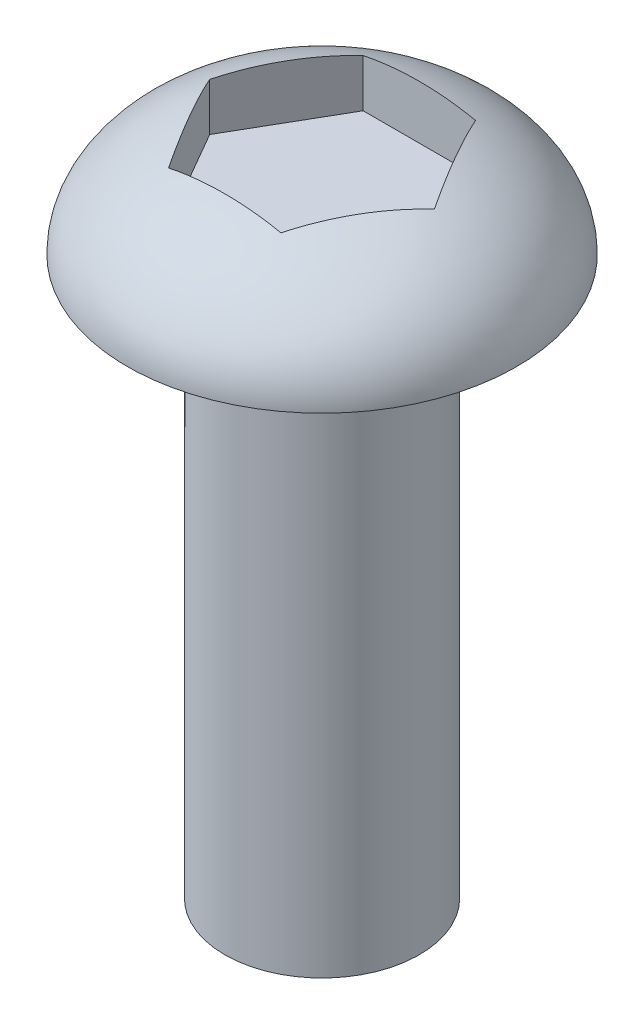
ISO-10303-21;
HEADER;
FILE_DESCRIPTION(('STEP AP214'),'2;1');
FILE_NAME('part.step','',(''),(''),'','','');
FILE_SCHEMA(('AUTOMOTIVE_DESIGN { 1 0 10303 214 1 1 1 1 }'));
ENDSEC;
DATA;
#1=APPLICATION_CONTEXT('core data for automotive mechanical design processes');
#2=APPLICATION_PROTOCOL_DEFINITION('international standard','automotive_design',2000,#1);
#3=PRODUCT_CONTEXT('',#1,'mechanical');
#4=PRODUCT('Part','Part','',(#3));
#5=PRODUCT_RELATED_PRODUCT_CATEGORY('part','',(#4));
#6=PRODUCT_DEFINITION_FORMATION('','',#4);
#7=PRODUCT_DEFINITION_CONTEXT('part definition',#1,'design');
#8=PRODUCT_DEFINITION('design','',#6,#7);
#9=PRODUCT_DEFINITION_SHAPE('','',#8);
#10=(LENGTH_UNIT() NAMED_UNIT(*) SI_UNIT(.MILLI.,.METRE.));
#11=(NAMED_UNIT(*) PLANE_ANGLE_UNIT() SI_UNIT($,.RADIAN.));
#12=(NAMED_UNIT(*) SI_UNIT($,.STERADIAN.) SOLID_ANGLE_UNIT());
#13=UNCERTAINTY_MEASURE_WITH_UNIT(LENGTH_MEASURE(1.E-05),#10,'distance_accuracy_value','');
#14=(GEOMETRIC_REPRESENTATION_CONTEXT(3) GLOBAL_UNCERTAINTY_ASSIGNED_CONTEXT((#13)) GLOBAL_UNIT_ASSIGNED_CONTEXT((#10,
#11,#12)) REPRESENTATION_CONTEXT('',''));
#15=CARTESIAN_POINT('',(0.,0.,0.));
#16=DIRECTION('',(0.,0.,1.));
#17=DIRECTION('',(1.,0.,0.));
#18=AXIS2_PLACEMENT_3D('',#15,#16,#17);
#19=CARTESIAN_POINT('',(0.,14.334,0.));
#20=DIRECTION('',(0.,-1.,0.));
#21=DIRECTION('',(0.,0.,-1.));
#22=AXIS2_PLACEMENT_3D('',#19,#20,#21);
#23=CYLINDRICAL_SURFACE('',#22,2.5);
#24=CARTESIAN_POINT('',(0.,14.334,0.));
#25=DIRECTION('',(0.,1.,0.));
#26=DIRECTION('',(0.,0.,1.));
#27=AXIS2_PLACEMENT_3D('',#24,#25,#26);
#28=CIRCLE('',#27,2.5);
#29=CARTESIAN_POINT('',(0.,14.334,2.5));
#30=VERTEX_POINT('',#29);
#31=EDGE_CURVE('E247',#30,#30,#28,.T.);
#32=ORIENTED_EDGE('',*,*,#31,.F.);
#33=EDGE_LOOP('',(#32));
#34=FACE_BOUND('',#33,.T.);
#35=CARTESIAN_POINT('',(0.,0.,0.));
#36=DIRECTION('',(0.,1.,0.));
#37=DIRECTION('',(0.,0.,1.));
#38=AXIS2_PLACEMENT_3D('',#35,#36,#37);
#39=CIRCLE('',#38,2.5);
#40=CARTESIAN_POINT('',(0.,0.,2.5));
#41=VERTEX_POINT('',#40);
#42=EDGE_CURVE('E250',#41,#41,#39,.T.);
#43=ORIENTED_EDGE('',*,*,#42,.T.);
#44=EDGE_LOOP('',(#43));
#45=FACE_BOUND('',#44,.T.);
#46=ADVANCED_FACE('F55',(#34,#45),#23,.T.);
#47=CARTESIAN_POINT('',(0.,0.,0.));
#48=DIRECTION('',(0.,1.,0.));
#49=DIRECTION('',(0.,0.,1.));
#50=AXIS2_PLACEMENT_3D('',#47,#48,#49);
#51=PLANE('',#50);
#52=ORIENTED_EDGE('',*,*,#42,.F.);
#53=EDGE_LOOP('',(#52));
#54=FACE_BOUND('',#53,.T.);
#55=ADVANCED_FACE('F238',(#54),#51,.F.);
#56=CARTESIAN_POINT('',(0.,14.334,0.));
#57=DIRECTION('',(0.,-1.,0.));
#58=DIRECTION('',(0.,0.,-1.));
#59=AXIS2_PLACEMENT_3D('',#56,#57,#58);
#60=PLANE('',#59);
#61=ORIENTED_EDGE('',*,*,#31,.T.);
#62=EDGE_LOOP('',(#61));
#63=FACE_BOUND('',#62,.T.);
#64=CARTESIAN_POINT('',(0.,14.334,0.));
#65=DIRECTION('',(0.,-1.,0.));
#66=DIRECTION('',(0.,0.,-1.));
#67=AXIS2_PLACEMENT_3D('',#64,#65,#66);
#68=CIRCLE('',#67,5.);
#69=CARTESIAN_POINT('',(0.,14.334,-5.));
#70=VERTEX_POINT('',#69);
#71=EDGE_CURVE('E152',#70,#70,#68,.T.);
#72=ORIENTED_EDGE('',*,*,#71,.T.);
#73=EDGE_LOOP('',(#72));
#74=FACE_BOUND('',#73,.T.);
#75=ADVANCED_FACE('F173',(#63,#74),#60,.T.);
#76=CARTESIAN_POINT('',(0.,14.334,0.));
#77=DIRECTION('',(1.,0.,0.));
#78=DIRECTION('',(0.,0.,-1.));
#79=AXIS2_PLACEMENT_3D('',#76,#77,#78);
#80=ELLIPSE('',#79,5.,3.);
#81=TRIMMED_CURVE('',#80,(PARAMETER_VALUE(-1.5707963267949)),(PARAMETER_VALUE(1.5707963267949)),
.T.,.PARAMETER.);
#82=CARTESIAN_POINT('',(0.,14.334,0.));
#83=DIRECTION('',(0.,-1.,0.));
#84=AXIS1_PLACEMENT('',#82,#83);
#85=SURFACE_OF_REVOLUTION('',#81,#84);
#86=CARTESIAN_POINT('',(1.44337567297407,16.7834897427832,2.5));
#87=CARTESIAN_POINT('',(1.49120527666938,16.803775342124,2.41715669629383));
#88=CARTESIAN_POINT('',(1.53925461730029,16.8218989634493,2.33393279705091));
#89=CARTESIAN_POINT('',(1.63569822698069,16.8539373538292,2.16688756501911));
#90=CARTESIAN_POINT('',(1.68409245968437,16.8678525598582,2.08306629518303));
#91=CARTESIAN_POINT('',(1.82970216155214,16.9034727249266,1.8308628934731));
#92=CARTESIAN_POINT('',(1.92730855645312,16.9190371611483,1.66180365836097));
#93=CARTESIAN_POINT('',(2.1211665221515,16.9341120007637,1.32603181231942));
#94=CARTESIAN_POINT('',(2.21741331466225,16.9338876455773,1.15932747762528));
#95=CARTESIAN_POINT('',(2.40954917302526,16.9180413413124,0.826538408984685));
#96=CARTESIAN_POINT('',(2.50543842664516,16.9024291319321,0.660453349815152));
#97=CARTESIAN_POINT('',(2.64868825337643,16.8671068327157,0.412337371741155));
#98=CARTESIAN_POINT('',(2.69642789242686,16.8533124296512,0.329649891370808));
#99=CARTESIAN_POINT('',(2.79176839563484,16.8215609300231,0.1645152957954));
#100=CARTESIAN_POINT('',(2.83936780183945,16.8035863476653,0.0820707058389169));
#101=CARTESIAN_POINT('',(2.88675134594812,16.7834897427832,0.));
#102=B_SPLINE_CURVE_WITH_KNOTS('',3,(#86,#87,#88,#89,#90,#91,#92,#93,#94,#95,#96,#97,#98,#99,
#100,#101),.UNSPECIFIED.,.F.,.F.,(4,2,2,2,2,2,2,4),(0.,0.293301097681086,0.586571730425494,
1.17333340904144,1.75024026543772,2.32678220463683,2.61611671310365,2.90668400509651),.UNSPECIFIED.);
#103=CARTESIAN_POINT('',(1.44337567297407,16.7834897427832,2.5));
#104=VERTEX_POINT('',#103);
#105=CARTESIAN_POINT('',(2.88675134594813,16.7834897427832,0.));
#106=VERTEX_POINT('',#105);
#107=EDGE_CURVE('E11',#104,#106,#102,.T.);
#108=ORIENTED_EDGE('',*,*,#107,.F.);
#109=CARTESIAN_POINT('',(-1.44337567297406,16.7834897427832,2.5));
#110=CARTESIAN_POINT('',(-1.34771646558344,16.803775342124,2.5));
#111=CARTESIAN_POINT('',(-1.25161778432161,16.8218989634493,2.5));
#112=CARTESIAN_POINT('',(-1.0587305649608,16.8539373538292,2.5));
#113=CARTESIAN_POINT('',(-0.961942099553453,16.8678525598582,2.5));
#114=CARTESIAN_POINT('',(-0.670722695817917,16.9034727249266,2.5));
#115=CARTESIAN_POINT('',(-0.475509906015961,16.9190371611483,2.5));
#116=CARTESIAN_POINT('',(-0.0877939746191878,16.9341120007637,2.5));
#117=CARTESIAN_POINT('',(0.1046996104023,16.9338876455773,2.5));
#118=CARTESIAN_POINT('',(0.48897132712832,16.9180413413124,2.5));
#119=CARTESIAN_POINT('',(0.680749834368129,16.9024291319321,2.5));
#120=CARTESIAN_POINT('',(0.967249487830669,16.8671068327157,2.5));
#121=CARTESIAN_POINT('',(1.06272876593153,16.8533124296512,2.5));
#122=CARTESIAN_POINT('',(1.25340977234749,16.8215609300231,2.5));
#123=CARTESIAN_POINT('',(1.3486085847567,16.8035863476653,2.5));
#124=CARTESIAN_POINT('',(1.44337567297405,16.7834897427832,2.5));
#125=B_SPLINE_CURVE_WITH_KNOTS('',3,(#109,#110,#111,#112,#113,#114,#115,#116,#117,#118,#119,
#120,#121,#122,#123,#124),.UNSPECIFIED.,.F.,.F.,(4,2,2,2,2,2,2,4),(0.,0.293301097681087,
0.586571730425495,1.17333340904144,1.75024026543772,2.32678220463683,2.61611671310365,
2.90668400509651),.UNSPECIFIED.);
#126=CARTESIAN_POINT('',(-1.44337567297406,16.7834897427832,2.5));
#127=VERTEX_POINT('',#126);
#128=EDGE_CURVE('E69',#127,#104,#125,.T.);
#129=ORIENTED_EDGE('',*,*,#128,.F.);
#130=CARTESIAN_POINT('',(-2.88675134594813,16.7834897427832,0.));
#131=CARTESIAN_POINT('',(-2.83892174225281,16.803775342124,0.0828433037061677));
#132=CARTESIAN_POINT('',(-2.7908724016219,16.8218989634493,0.16606720294909));
#133=CARTESIAN_POINT('',(-2.6944287919415,16.8539373538292,0.333112434980892));
#134=CARTESIAN_POINT('',(-2.64603455923782,16.8678525598582,0.416933704816969));
#135=CARTESIAN_POINT('',(-2.50042485737006,16.9034727249266,0.6691371065269));
#136=CARTESIAN_POINT('',(-2.40281846246908,16.9190371611483,0.838196341639026));
#137=CARTESIAN_POINT('',(-2.20896049677069,16.9341120007637,1.17396818768058));
#138=CARTESIAN_POINT('',(-2.11271370425995,16.9338876455773,1.34067252237472));
#139=CARTESIAN_POINT('',(-1.92057784589694,16.9180413413124,1.67346159101532));
#140=CARTESIAN_POINT('',(-1.82468859227703,16.9024291319321,1.83954665018485));
#141=CARTESIAN_POINT('',(-1.68143876554576,16.8671068327157,2.08766262825885));
#142=CARTESIAN_POINT('',(-1.63369912649533,16.8533124296512,2.17035010862919));
#143=CARTESIAN_POINT('',(-1.53835862328735,16.8215609300231,2.3354847042046));
#144=CARTESIAN_POINT('',(-1.49075921708274,16.8035863476653,2.41792929416108));
#145=CARTESIAN_POINT('',(-1.44337567297407,16.7834897427832,2.49999999999999));
#146=B_SPLINE_CURVE_WITH_KNOTS('',3,(#130,#131,#132,#133,#134,#135,#136,#137,#138,#139,#140,
#141,#142,#143,#144,#145),.UNSPECIFIED.,.F.,.F.,(4,2,2,2,2,2,2,4),(0.,0.293301097681087,
0.586571730425495,1.17333340904144,1.75024026543772,2.32678220463683,2.61611671310365,
2.90668400509651),.UNSPECIFIED.);
#147=CARTESIAN_POINT('',(-2.88675134594813,16.7834897427832,0.));
#148=VERTEX_POINT('',#147);
#149=EDGE_CURVE('E204',#148,#127,#146,.T.);
#150=ORIENTED_EDGE('',*,*,#149,.F.);
#151=CARTESIAN_POINT('',(-1.44337567297406,16.7834897427832,-2.5));
#152=CARTESIAN_POINT('',(-1.49120527666938,16.803775342124,-2.41715669629383));
#153=CARTESIAN_POINT('',(-1.53925461730029,16.8218989634493,-2.33393279705091));
#154=CARTESIAN_POINT('',(-1.63569822698069,16.8539373538292,-2.16688756501911));
#155=CARTESIAN_POINT('',(-1.68409245968437,16.8678525598582,-2.08306629518303));
#156=CARTESIAN_POINT('',(-1.82970216155214,16.9034727249266,-1.8308628934731));
#157=CARTESIAN_POINT('',(-1.92730855645311,16.9190371611483,-1.66180365836098));
#158=CARTESIAN_POINT('',(-2.1211665221515,16.9341120007637,-1.32603181231943));
#159=CARTESIAN_POINT('',(-2.21741331466224,16.9338876455773,-1.15932747762528));
#160=CARTESIAN_POINT('',(-2.40954917302525,16.9180413413124,-0.826538408984687));
#161=CARTESIAN_POINT('',(-2.50543842664516,16.9024291319321,-0.660453349815155));
#162=CARTESIAN_POINT('',(-2.64868825337643,16.8671068327157,-0.412337371741156));
#163=CARTESIAN_POINT('',(-2.69642789242686,16.8533124296512,-0.329649891370809));
#164=CARTESIAN_POINT('',(-2.79176839563484,16.8215609300231,-0.1645152957954));
#165=CARTESIAN_POINT('',(-2.83936780183945,16.8035863476653,-0.0820707058389162));
#166=CARTESIAN_POINT('',(-2.88675134594812,16.7834897427832,0.));
#167=B_SPLINE_CURVE_WITH_KNOTS('',3,(#151,#152,#153,#154,#155,#156,#157,#158,#159,#160,#161,
#162,#163,#164,#165,#166),.UNSPECIFIED.,.F.,.F.,(4,2,2,2,2,2,2,4),(0.,0.293301097681087,
0.586571730425495,1.17333340904144,1.75024026543772,2.32678220463683,2.61611671310365,
2.90668400509651),.UNSPECIFIED.);
#168=CARTESIAN_POINT('',(-1.44337567297406,16.7834897427832,-2.5));
#169=VERTEX_POINT('',#168);
#170=EDGE_CURVE('E197',#169,#148,#167,.T.);
#171=ORIENTED_EDGE('',*,*,#170,.F.);
#172=CARTESIAN_POINT('',(1.44337567297406,16.7834897427832,-2.5));
#173=CARTESIAN_POINT('',(1.34771646558344,16.803775342124,-2.5));
#174=CARTESIAN_POINT('',(1.25161778432161,16.8218989634493,-2.5));
#175=CARTESIAN_POINT('',(1.0587305649608,16.8539373538292,-2.5));
#176=CARTESIAN_POINT('',(0.961942099553454,16.8678525598582,-2.5));
#177=CARTESIAN_POINT('',(0.670722695817918,16.9034727249266,-2.5));
#178=CARTESIAN_POINT('',(0.475509906015962,16.9190371611483,-2.5));
#179=CARTESIAN_POINT('',(0.087793974619189,16.9341120007637,-2.5));
#180=CARTESIAN_POINT('',(-0.104699610402298,16.9338876455773,-2.5));
#181=CARTESIAN_POINT('',(-0.48897132712832,16.9180413413124,-2.5));
#182=CARTESIAN_POINT('',(-0.680749834368129,16.9024291319321,-2.5));
#183=CARTESIAN_POINT('',(-0.967249487830668,16.8671068327157,-2.5));
#184=CARTESIAN_POINT('',(-1.06272876593153,16.8533124296512,-2.5));
#185=CARTESIAN_POINT('',(-1.25340977234749,16.8215609300231,-2.5));
#186=CARTESIAN_POINT('',(-1.3486085847567,16.8035863476653,-2.5));
#187=CARTESIAN_POINT('',(-1.44337567297405,16.7834897427832,-2.5));
#188=B_SPLINE_CURVE_WITH_KNOTS('',3,(#172,#173,#174,#175,#176,#177,#178,#179,#180,#181,#182,
#183,#184,#185,#186,#187),.UNSPECIFIED.,.F.,.F.,(4,2,2,2,2,2,2,4),(0.,0.293301097681087,
0.586571730425496,1.17333340904144,1.75024026543772,2.32678220463683,2.61611671310365,
2.90668400509651),.UNSPECIFIED.);
#189=CARTESIAN_POINT('',(1.44337567297406,16.7834897427832,-2.5));
#190=VERTEX_POINT('',#189);
#191=EDGE_CURVE('E189',#190,#169,#188,.T.);
#192=ORIENTED_EDGE('',*,*,#191,.F.);
#193=CARTESIAN_POINT('',(2.88675134594813,16.7834897427832,0.));
#194=CARTESIAN_POINT('',(2.83892174225282,16.803775342124,-0.0828433037061678));
#195=CARTESIAN_POINT('',(2.7908724016219,16.8218989634493,-0.16606720294909));
#196=CARTESIAN_POINT('',(2.6944287919415,16.8539373538292,-0.333112434980892));
#197=CARTESIAN_POINT('',(2.64603455923782,16.8678525598582,-0.416933704816969));
#198=CARTESIAN_POINT('',(2.50042485737006,16.9034727249266,-0.6691371065269));
#199=CARTESIAN_POINT('',(2.40281846246908,16.9190371611483,-0.838196341639025));
#200=CARTESIAN_POINT('',(2.20896049677069,16.9341120007637,-1.17396818768058));
#201=CARTESIAN_POINT('',(2.11271370425995,16.9338876455773,-1.34067252237472));
#202=CARTESIAN_POINT('',(1.92057784589694,16.9180413413124,-1.67346159101531));
#203=CARTESIAN_POINT('',(1.82468859227703,16.9024291319321,-1.83954665018485));
#204=CARTESIAN_POINT('',(1.68143876554576,16.8671068327157,-2.08766262825884));
#205=CARTESIAN_POINT('',(1.63369912649533,16.8533124296512,-2.17035010862919));
#206=CARTESIAN_POINT('',(1.53835862328735,16.8215609300231,-2.3354847042046));
#207=CARTESIAN_POINT('',(1.49075921708275,16.8035863476653,-2.41792929416108));
#208=CARTESIAN_POINT('',(1.44337567297407,16.7834897427832,-2.49999999999999));
#209=B_SPLINE_CURVE_WITH_KNOTS('',3,(#193,#194,#195,#196,#197,#198,#199,#200,#201,#202,#203,
#204,#205,#206,#207,#208),.UNSPECIFIED.,.F.,.F.,(4,2,2,2,2,2,2,4),(0.,0.293301097681086,
0.586571730425494,1.17333340904144,1.75024026543772,2.32678220463683,2.61611671310365,
2.90668400509651),.UNSPECIFIED.);
#210=EDGE_CURVE('E180',#106,#190,#209,.T.);
#211=ORIENTED_EDGE('',*,*,#210,.F.);
#212=EDGE_LOOP('',(#108,#129,#150,#171,#192,#211));
#213=FACE_BOUND('',#212,.T.);
#214=ORIENTED_EDGE('',*,*,#71,.F.);
#215=EDGE_LOOP('',(#214));
#216=FACE_BOUND('',#215,.T.);
#217=ADVANCED_FACE('F169',(#213,#216),#85,.F.);
#218=CARTESIAN_POINT('',(1.44337567297407,15.556,2.5));
#219=DIRECTION('',(0.866025403784439,0.,0.5));
#220=DIRECTION('',(0.5,0.,-0.866025403784439));
#221=AXIS2_PLACEMENT_3D('',#218,#219,#220);
#222=PLANE('',#221);
#223=ORIENTED_EDGE('',*,*,#107,.T.);
#224=DIRECTION('',(0.,1.,0.));
#225=VECTOR('',#224,1.);
#226=CARTESIAN_POINT('',(2.88675134594813,15.556,0.));
#227=LINE('',#226,#225);
#228=CARTESIAN_POINT('',(2.88675134594813,15.556,0.));
#229=VERTEX_POINT('',#228);
#230=EDGE_CURVE('E76',#229,#106,#227,.T.);
#231=ORIENTED_EDGE('',*,*,#230,.F.);
#232=DIRECTION('',(0.5,0.,-0.866025403784439));
#233=VECTOR('',#232,1.);
#234=CARTESIAN_POINT('',(1.44337567297407,15.556,2.5));
#235=LINE('',#234,#233);
#236=CARTESIAN_POINT('',(1.44337567297407,15.556,2.5));
#237=VERTEX_POINT('',#236);
#238=EDGE_CURVE('E114',#237,#229,#235,.T.);
#239=ORIENTED_EDGE('',*,*,#238,.F.);
#240=DIRECTION('',(0.,1.,0.));
#241=VECTOR('',#240,1.);
#242=CARTESIAN_POINT('',(1.44337567297407,15.556,2.5));
#243=LINE('',#242,#241);
#244=EDGE_CURVE('E149',#237,#104,#243,.T.);
#245=ORIENTED_EDGE('',*,*,#244,.T.);
#246=EDGE_LOOP('',(#223,#231,#239,#245));
#247=FACE_BOUND('',#246,.T.);
#248=ADVANCED_FACE('F112',(#247),#222,.F.);
#249=CARTESIAN_POINT('',(-1.44337567297406,15.556,2.5));
#250=DIRECTION('',(0.,0.,1.));
#251=DIRECTION('',(1.,0.,0.));
#252=AXIS2_PLACEMENT_3D('',#249,#250,#251);
#253=PLANE('',#252);
#254=ORIENTED_EDGE('',*,*,#128,.T.);
#255=ORIENTED_EDGE('',*,*,#244,.F.);
#256=DIRECTION('',(1.,0.,0.));
#257=VECTOR('',#256,1.);
#258=CARTESIAN_POINT('',(-1.44337567297406,15.556,2.5));
#259=LINE('',#258,#257);
#260=CARTESIAN_POINT('',(-1.44337567297406,15.556,2.5));
#261=VERTEX_POINT('',#260);
#262=EDGE_CURVE('E120',#261,#237,#259,.T.);
#263=ORIENTED_EDGE('',*,*,#262,.F.);
#264=DIRECTION('',(0.,1.,0.));
#265=VECTOR('',#264,1.);
#266=CARTESIAN_POINT('',(-1.44337567297406,15.556,2.5));
#267=LINE('',#266,#265);
#268=EDGE_CURVE('E153',#261,#127,#267,.T.);
#269=ORIENTED_EDGE('',*,*,#268,.T.);
#270=EDGE_LOOP('',(#254,#255,#263,#269));
#271=FACE_BOUND('',#270,.T.);
#272=ADVANCED_FACE('F216',(#271),#253,.F.);
#273=CARTESIAN_POINT('',(-2.88675134594813,15.556,0.));
#274=DIRECTION('',(-0.866025403784438,0.,0.5));
#275=DIRECTION('',(0.5,0.,0.866025403784438));
#276=AXIS2_PLACEMENT_3D('',#273,#274,#275);
#277=PLANE('',#276);
#278=ORIENTED_EDGE('',*,*,#149,.T.);
#279=ORIENTED_EDGE('',*,*,#268,.F.);
#280=DIRECTION('',(0.5,0.,0.866025403784438));
#281=VECTOR('',#280,1.);
#282=CARTESIAN_POINT('',(-2.88675134594813,15.556,0.));
#283=LINE('',#282,#281);
#284=CARTESIAN_POINT('',(-2.88675134594813,15.556,0.));
#285=VERTEX_POINT('',#284);
#286=EDGE_CURVE('E144',#285,#261,#283,.T.);
#287=ORIENTED_EDGE('',*,*,#286,.F.);
#288=DIRECTION('',(0.,1.,0.));
#289=VECTOR('',#288,1.);
#290=CARTESIAN_POINT('',(-2.88675134594813,15.556,0.));
#291=LINE('',#290,#289);
#292=EDGE_CURVE('E156',#285,#148,#291,.T.);
#293=ORIENTED_EDGE('',*,*,#292,.T.);
#294=EDGE_LOOP('',(#278,#279,#287,#293));
#295=FACE_BOUND('',#294,.T.);
#296=ADVANCED_FACE('F220',(#295),#277,.F.);
#297=CARTESIAN_POINT('',(-1.44337567297406,15.556,-2.5));
#298=DIRECTION('',(-0.866025403784439,0.,-0.5));
#299=DIRECTION('',(-0.5,0.,0.866025403784439));
#300=AXIS2_PLACEMENT_3D('',#297,#298,#299);
#301=PLANE('',#300);
#302=ORIENTED_EDGE('',*,*,#170,.T.);
#303=ORIENTED_EDGE('',*,*,#292,.F.);
#304=DIRECTION('',(-0.5,0.,0.866025403784439));
#305=VECTOR('',#304,1.);
#306=CARTESIAN_POINT('',(-1.44337567297406,15.556,-2.5));
#307=LINE('',#306,#305);
#308=CARTESIAN_POINT('',(-1.44337567297406,15.556,-2.5));
#309=VERTEX_POINT('',#308);
#310=EDGE_CURVE('E140',#309,#285,#307,.T.);
#311=ORIENTED_EDGE('',*,*,#310,.F.);
#312=DIRECTION('',(0.,1.,0.));
#313=VECTOR('',#312,1.);
#314=CARTESIAN_POINT('',(-1.44337567297406,15.556,-2.5));
#315=LINE('',#314,#313);
#316=EDGE_CURVE('E160',#309,#169,#315,.T.);
#317=ORIENTED_EDGE('',*,*,#316,.T.);
#318=EDGE_LOOP('',(#302,#303,#311,#317));
#319=FACE_BOUND('',#318,.T.);
#320=ADVANCED_FACE('F223',(#319),#301,.F.);
#321=CARTESIAN_POINT('',(1.44337567297406,15.556,-2.5));
#322=DIRECTION('',(0.,0.,-1.));
#323=DIRECTION('',(-1.,0.,0.));
#324=AXIS2_PLACEMENT_3D('',#321,#322,#323);
#325=PLANE('',#324);
#326=ORIENTED_EDGE('',*,*,#191,.T.);
#327=ORIENTED_EDGE('',*,*,#316,.F.);
#328=DIRECTION('',(-1.,0.,0.));
#329=VECTOR('',#328,1.);
#330=CARTESIAN_POINT('',(1.44337567297406,15.556,-2.5));
#331=LINE('',#330,#329);
#332=CARTESIAN_POINT('',(1.44337567297406,15.556,-2.5));
#333=VERTEX_POINT('',#332);
#334=EDGE_CURVE('E130',#333,#309,#331,.T.);
#335=ORIENTED_EDGE('',*,*,#334,.F.);
#336=DIRECTION('',(0.,1.,0.));
#337=VECTOR('',#336,1.);
#338=CARTESIAN_POINT('',(1.44337567297406,15.556,-2.5));
#339=LINE('',#338,#337);
#340=EDGE_CURVE('E119',#333,#190,#339,.T.);
#341=ORIENTED_EDGE('',*,*,#340,.T.);
#342=EDGE_LOOP('',(#326,#327,#335,#341));
#343=FACE_BOUND('',#342,.T.);
#344=ADVANCED_FACE('F227',(#343),#325,.F.);
#345=CARTESIAN_POINT('',(2.88675134594813,15.556,0.));
#346=DIRECTION('',(0.866025403784439,0.,-0.5));
#347=DIRECTION('',(-0.5,0.,-0.866025403784439));
#348=AXIS2_PLACEMENT_3D('',#345,#346,#347);
#349=PLANE('',#348);
#350=ORIENTED_EDGE('',*,*,#210,.T.);
#351=ORIENTED_EDGE('',*,*,#340,.F.);
#352=DIRECTION('',(-0.5,0.,-0.866025403784439));
#353=VECTOR('',#352,1.);
#354=CARTESIAN_POINT('',(2.88675134594813,15.556,0.));
#355=LINE('',#354,#353);
#356=EDGE_CURVE('E123',#229,#333,#355,.T.);
#357=ORIENTED_EDGE('',*,*,#356,.F.);
#358=ORIENTED_EDGE('',*,*,#230,.T.);
#359=EDGE_LOOP('',(#350,#351,#357,#358));
#360=FACE_BOUND('',#359,.T.);
#361=ADVANCED_FACE('F124',(#360),#349,.F.);
#362=CARTESIAN_POINT('',(0.,15.556,0.));
#363=DIRECTION('',(0.,1.,0.));
#364=DIRECTION('',(0.,0.,1.));
#365=AXIS2_PLACEMENT_3D('',#362,#363,#364);
#366=PLANE('',#365);
#367=ORIENTED_EDGE('',*,*,#238,.T.);
#368=ORIENTED_EDGE('',*,*,#356,.T.);
#369=ORIENTED_EDGE('',*,*,#334,.T.);
#370=ORIENTED_EDGE('',*,*,#310,.T.);
#371=ORIENTED_EDGE('',*,*,#286,.T.);
#372=ORIENTED_EDGE('',*,*,#262,.T.);
#373=EDGE_LOOP('',(#367,#368,#369,#370,#371,#372));
#374=FACE_BOUND('',#373,.T.);
#375=ADVANCED_FACE('F132',(#374),#366,.T.);
#376=CLOSED_SHELL('',(#46,#55,#75,#217,#248,#272,#296,#320,#344,#361,#375));
#377=MANIFOLD_SOLID_BREP('B2',#376);
#378=ADVANCED_BREP_SHAPE_REPRESENTATION('',(#18,#377),#14);
#379=SHAPE_DEFINITION_REPRESENTATION(#9,#378);
ENDSEC;
END-ISO-10303-21;
